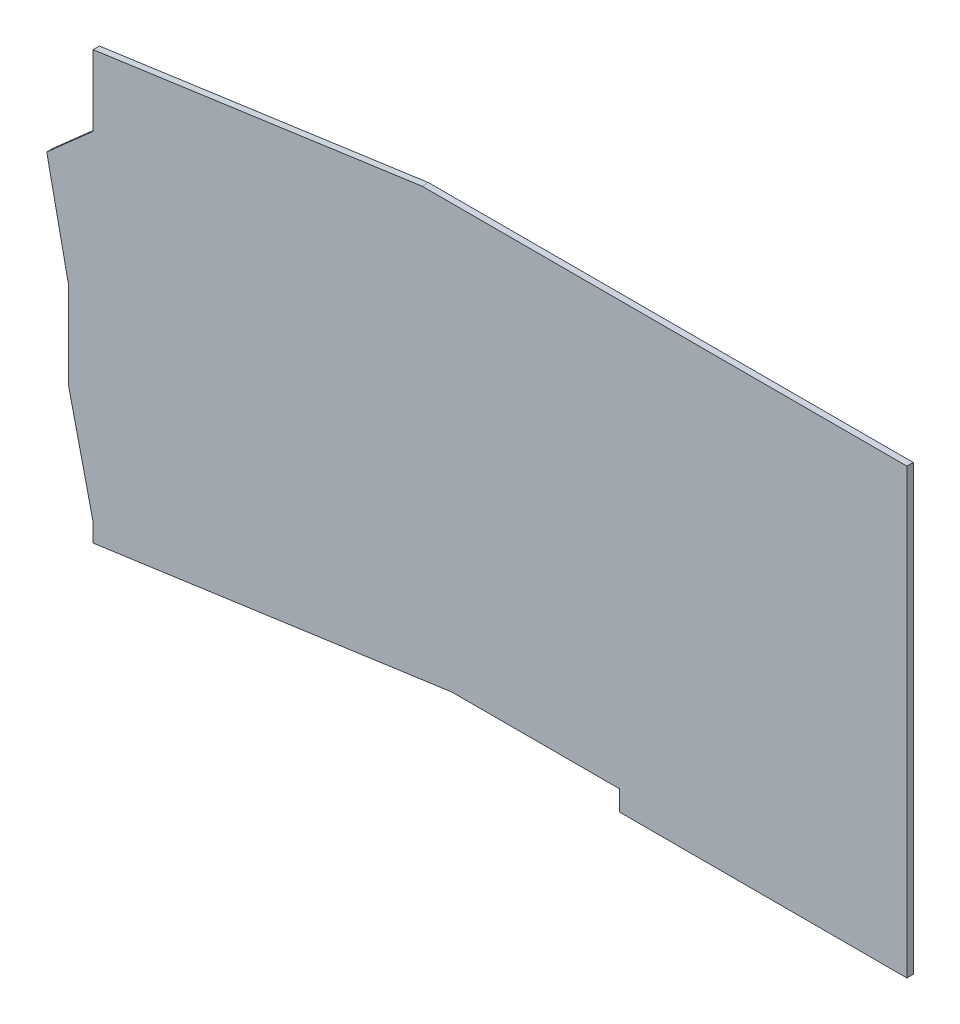
ISO-10303-21;
HEADER;
FILE_DESCRIPTION(('STEP AP214'),'2;1');
FILE_NAME('part.step','',(''),(''),'','','');
FILE_SCHEMA(('AUTOMOTIVE_DESIGN { 1 0 10303 214 1 1 1 1 }'));
ENDSEC;
DATA;
#1=APPLICATION_CONTEXT('core data for automotive mechanical design processes');
#2=APPLICATION_PROTOCOL_DEFINITION('international standard','automotive_design',2000,#1);
#3=PRODUCT_CONTEXT('',#1,'mechanical');
#4=PRODUCT('Part','Part','',(#3));
#5=PRODUCT_RELATED_PRODUCT_CATEGORY('part','',(#4));
#6=PRODUCT_DEFINITION_FORMATION('','',#4);
#7=PRODUCT_DEFINITION_CONTEXT('part definition',#1,'design');
#8=PRODUCT_DEFINITION('design','',#6,#7);
#9=PRODUCT_DEFINITION_SHAPE('','',#8);
#10=(LENGTH_UNIT() NAMED_UNIT(*) SI_UNIT(.MILLI.,.METRE.));
#11=(NAMED_UNIT(*) PLANE_ANGLE_UNIT() SI_UNIT($,.RADIAN.));
#12=(NAMED_UNIT(*) SI_UNIT($,.STERADIAN.) SOLID_ANGLE_UNIT());
#13=UNCERTAINTY_MEASURE_WITH_UNIT(LENGTH_MEASURE(1.E-05),#10,'distance_accuracy_value','');
#14=(GEOMETRIC_REPRESENTATION_CONTEXT(3) GLOBAL_UNCERTAINTY_ASSIGNED_CONTEXT((#13)) GLOBAL_UNIT_ASSIGNED_CONTEXT((#10,
#11,#12)) REPRESENTATION_CONTEXT('',''));
#15=CARTESIAN_POINT('',(0.,0.,0.));
#16=DIRECTION('',(0.,0.,1.));
#17=DIRECTION('',(1.,0.,0.));
#18=AXIS2_PLACEMENT_3D('',#15,#16,#17);
#19=CARTESIAN_POINT('',(128.863446305755,57.7785600457267,1.5));
#20=DIRECTION('',(0.978814898005859,0.204747150021143,0.));
#21=DIRECTION('',(-0.204747150021143,0.978814898005859,0.));
#22=AXIS2_PLACEMENT_3D('',#19,#20,#21);
#23=PLANE('',#22);
#24=DIRECTION('',(0.204747150021143,-0.978814898005859,0.));
#25=VECTOR('',#24,1.);
#26=CARTESIAN_POINT('',(128.863446305755,57.7785600457267,0.));
#27=LINE('',#26,#25);
#28=CARTESIAN_POINT('',(128.863446305755,57.7785600457267,0.));
#29=VERTEX_POINT('',#28);
#30=CARTESIAN_POINT('',(134.062572146089,32.923601973779,0.));
#31=VERTEX_POINT('',#30);
#32=EDGE_CURVE('E159',#29,#31,#27,.T.);
#33=ORIENTED_EDGE('',*,*,#32,.T.);
#34=DIRECTION('',(0.,0.,-1.));
#35=VECTOR('',#34,1.);
#36=CARTESIAN_POINT('',(134.062572146089,32.923601973779,1.5));
#37=LINE('',#36,#35);
#38=CARTESIAN_POINT('',(134.062572146089,32.923601973779,1.5));
#39=VERTEX_POINT('',#38);
#40=EDGE_CURVE('E11',#39,#31,#37,.T.);
#41=ORIENTED_EDGE('',*,*,#40,.F.);
#42=DIRECTION('',(0.204747150021143,-0.978814898005859,0.));
#43=VECTOR('',#42,1.);
#44=CARTESIAN_POINT('',(128.863446305755,57.7785600457267,1.5));
#45=LINE('',#44,#43);
#46=CARTESIAN_POINT('',(128.863446305755,57.7785600457267,1.5));
#47=VERTEX_POINT('',#46);
#48=EDGE_CURVE('E183',#47,#39,#45,.T.);
#49=ORIENTED_EDGE('',*,*,#48,.F.);
#50=DIRECTION('',(0.,0.,-1.));
#51=VECTOR('',#50,1.);
#52=CARTESIAN_POINT('',(128.863446305755,57.7785600457267,1.5));
#53=LINE('',#52,#51);
#54=EDGE_CURVE('E155',#47,#29,#53,.T.);
#55=ORIENTED_EDGE('',*,*,#54,.T.);
#56=EDGE_LOOP('',(#33,#41,#49,#55));
#57=FACE_BOUND('',#56,.T.);
#58=ADVANCED_FACE('F33',(#57),#23,.F.);
#59=CARTESIAN_POINT('',(134.062572146089,32.923601973779,1.5));
#60=DIRECTION('',(1.,0.,0.));
#61=DIRECTION('',(0.,0.,-1.));
#62=AXIS2_PLACEMENT_3D('',#59,#60,#61);
#63=PLANE('',#62);
#64=DIRECTION('',(0.,-1.,0.));
#65=VECTOR('',#64,1.);
#66=CARTESIAN_POINT('',(134.062572146089,32.923601973779,0.));
#67=LINE('',#66,#65);
#68=CARTESIAN_POINT('',(134.062572146089,12.3008028689447,0.));
#69=VERTEX_POINT('',#68);
#70=EDGE_CURVE('E162',#31,#69,#67,.T.);
#71=ORIENTED_EDGE('',*,*,#70,.T.);
#72=DIRECTION('',(0.,0.,-1.));
#73=VECTOR('',#72,1.);
#74=CARTESIAN_POINT('',(134.062572146089,12.3008028689447,1.5));
#75=LINE('',#74,#73);
#76=CARTESIAN_POINT('',(134.062572146089,12.3008028689447,1.5));
#77=VERTEX_POINT('',#76);
#78=EDGE_CURVE('E41',#77,#69,#75,.T.);
#79=ORIENTED_EDGE('',*,*,#78,.F.);
#80=DIRECTION('',(0.,-1.,0.));
#81=VECTOR('',#80,1.);
#82=CARTESIAN_POINT('',(134.062572146089,32.923601973779,1.5));
#83=LINE('',#82,#81);
#84=EDGE_CURVE('E107',#39,#77,#83,.T.);
#85=ORIENTED_EDGE('',*,*,#84,.F.);
#86=ORIENTED_EDGE('',*,*,#40,.T.);
#87=EDGE_LOOP('',(#71,#79,#85,#86));
#88=FACE_BOUND('',#87,.T.);
#89=ADVANCED_FACE('F266',(#88),#63,.F.);
#90=CARTESIAN_POINT('',(134.062572146089,12.3008028689447,1.5));
#91=DIRECTION('',(0.974112033772326,0.2260657994035,0.));
#92=DIRECTION('',(-0.2260657994035,0.974112033772326,0.));
#93=AXIS2_PLACEMENT_3D('',#90,#91,#92);
#94=PLANE('',#93);
#95=DIRECTION('',(0.2260657994035,-0.974112033772326,0.));
#96=VECTOR('',#95,1.);
#97=CARTESIAN_POINT('',(134.062572146089,12.3008028689447,0.));
#98=LINE('',#97,#96);
#99=CARTESIAN_POINT('',(139.839489186045,-12.5917922143182,0.));
#100=VERTEX_POINT('',#99);
#101=EDGE_CURVE('E164',#69,#100,#98,.T.);
#102=ORIENTED_EDGE('',*,*,#101,.T.);
#103=DIRECTION('',(0.,0.,-1.));
#104=VECTOR('',#103,1.);
#105=CARTESIAN_POINT('',(139.839489186045,-12.5917922143182,1.5));
#106=LINE('',#105,#104);
#107=CARTESIAN_POINT('',(139.839489186045,-12.5917922143182,1.5));
#108=VERTEX_POINT('',#107);
#109=EDGE_CURVE('E205',#108,#100,#106,.T.);
#110=ORIENTED_EDGE('',*,*,#109,.F.);
#111=DIRECTION('',(0.2260657994035,-0.974112033772326,0.));
#112=VECTOR('',#111,1.);
#113=CARTESIAN_POINT('',(134.062572146089,12.3008028689447,1.5));
#114=LINE('',#113,#112);
#115=EDGE_CURVE('E213',#77,#108,#114,.T.);
#116=ORIENTED_EDGE('',*,*,#115,.F.);
#117=ORIENTED_EDGE('',*,*,#78,.T.);
#118=EDGE_LOOP('',(#102,#110,#116,#117));
#119=FACE_BOUND('',#118,.T.);
#120=ADVANCED_FACE('F211',(#119),#94,.F.);
#121=CARTESIAN_POINT('',(139.839489186045,-12.5917922143182,1.5));
#122=DIRECTION('',(1.,0.,0.));
#123=DIRECTION('',(0.,0.,-1.));
#124=AXIS2_PLACEMENT_3D('',#121,#122,#123);
#125=PLANE('',#124);
#126=DIRECTION('',(0.,-1.,0.));
#127=VECTOR('',#126,1.);
#128=CARTESIAN_POINT('',(139.839489186045,-12.5917922143182,0.));
#129=LINE('',#128,#127);
#130=CARTESIAN_POINT('',(139.839489186045,-16.928223482479,0.));
#131=VERTEX_POINT('',#130);
#132=EDGE_CURVE('E166',#100,#131,#129,.T.);
#133=ORIENTED_EDGE('',*,*,#132,.T.);
#134=DIRECTION('',(0.,0.,-1.));
#135=VECTOR('',#134,1.);
#136=CARTESIAN_POINT('',(139.839489186045,-16.928223482479,1.5));
#137=LINE('',#136,#135);
#138=CARTESIAN_POINT('',(139.839489186045,-16.928223482479,1.5));
#139=VERTEX_POINT('',#138);
#140=EDGE_CURVE('E202',#139,#131,#137,.T.);
#141=ORIENTED_EDGE('',*,*,#140,.F.);
#142=DIRECTION('',(0.,-1.,0.));
#143=VECTOR('',#142,1.);
#144=CARTESIAN_POINT('',(139.839489186045,-12.5917922143182,1.5));
#145=LINE('',#144,#143);
#146=EDGE_CURVE('E231',#108,#139,#145,.T.);
#147=ORIENTED_EDGE('',*,*,#146,.F.);
#148=ORIENTED_EDGE('',*,*,#109,.T.);
#149=EDGE_LOOP('',(#133,#141,#147,#148));
#150=FACE_BOUND('',#149,.T.);
#151=ADVANCED_FACE('F222',(#150),#125,.F.);
#152=CARTESIAN_POINT('',(139.839489186045,-16.928223482479,1.5));
#153=DIRECTION('',(-0.139075137583757,0.990281831655039,0.));
#154=DIRECTION('',(-0.990281831655039,-0.139075137583757,0.));
#155=AXIS2_PLACEMENT_3D('',#152,#153,#154);
#156=PLANE('',#155);
#157=DIRECTION('',(0.990281831655039,0.139075137583757,0.));
#158=VECTOR('',#157,1.);
#159=CARTESIAN_POINT('',(139.839489186045,-16.928223482479,0.));
#160=LINE('',#159,#158);
#161=CARTESIAN_POINT('',(224.774174161684,-5.,0.));
#162=VERTEX_POINT('',#161);
#163=EDGE_CURVE('E168',#131,#162,#160,.T.);
#164=ORIENTED_EDGE('',*,*,#163,.T.);
#165=DIRECTION('',(0.,0.,-1.));
#166=VECTOR('',#165,1.);
#167=CARTESIAN_POINT('',(224.774174161684,-5.,1.5));
#168=LINE('',#167,#166);
#169=CARTESIAN_POINT('',(224.774174161684,-5.,1.5));
#170=VERTEX_POINT('',#169);
#171=EDGE_CURVE('E199',#170,#162,#168,.T.);
#172=ORIENTED_EDGE('',*,*,#171,.F.);
#173=DIRECTION('',(0.990281831655039,0.139075137583757,0.));
#174=VECTOR('',#173,1.);
#175=CARTESIAN_POINT('',(139.839489186045,-16.928223482479,1.5));
#176=LINE('',#175,#174);
#177=EDGE_CURVE('E228',#139,#170,#176,.T.);
#178=ORIENTED_EDGE('',*,*,#177,.F.);
#179=ORIENTED_EDGE('',*,*,#140,.T.);
#180=EDGE_LOOP('',(#164,#172,#178,#179));
#181=FACE_BOUND('',#180,.T.);
#182=ADVANCED_FACE('F226',(#181),#156,.F.);
#183=CARTESIAN_POINT('',(224.774174161684,-5.,1.5));
#184=DIRECTION('',(0.,1.,0.));
#185=DIRECTION('',(-1.,0.,0.));
#186=AXIS2_PLACEMENT_3D('',#183,#184,#185);
#187=PLANE('',#186);
#188=DIRECTION('',(1.,0.,0.));
#189=VECTOR('',#188,1.);
#190=CARTESIAN_POINT('',(224.774174161684,-5.,0.));
#191=LINE('',#190,#189);
#192=CARTESIAN_POINT('',(264.483473527003,-5.,0.));
#193=VERTEX_POINT('',#192);
#194=EDGE_CURVE('E170',#162,#193,#191,.T.);
#195=ORIENTED_EDGE('',*,*,#194,.T.);
#196=DIRECTION('',(0.,0.,-1.));
#197=VECTOR('',#196,1.);
#198=CARTESIAN_POINT('',(264.483473527003,-5.,1.5));
#199=LINE('',#198,#197);
#200=CARTESIAN_POINT('',(264.483473527003,-5.,1.5));
#201=VERTEX_POINT('',#200);
#202=EDGE_CURVE('E196',#201,#193,#199,.T.);
#203=ORIENTED_EDGE('',*,*,#202,.F.);
#204=DIRECTION('',(1.,0.,0.));
#205=VECTOR('',#204,1.);
#206=CARTESIAN_POINT('',(224.774174161684,-5.,1.5));
#207=LINE('',#206,#205);
#208=EDGE_CURVE('E230',#170,#201,#207,.T.);
#209=ORIENTED_EDGE('',*,*,#208,.F.);
#210=ORIENTED_EDGE('',*,*,#171,.T.);
#211=EDGE_LOOP('',(#195,#203,#209,#210));
#212=FACE_BOUND('',#211,.T.);
#213=ADVANCED_FACE('F279',(#212),#187,.F.);
#214=CARTESIAN_POINT('',(264.483473527003,-5.,1.5));
#215=DIRECTION('',(1.,0.,0.));
#216=DIRECTION('',(0.,0.,-1.));
#217=AXIS2_PLACEMENT_3D('',#214,#215,#216);
#218=PLANE('',#217);
#219=DIRECTION('',(0.,-1.,0.));
#220=VECTOR('',#219,1.);
#221=CARTESIAN_POINT('',(264.483473527003,-5.,0.));
#222=LINE('',#221,#220);
#223=CARTESIAN_POINT('',(264.483473527003,-9.76217406489741,0.));
#224=VERTEX_POINT('',#223);
#225=EDGE_CURVE('E172',#193,#224,#222,.T.);
#226=ORIENTED_EDGE('',*,*,#225,.T.);
#227=DIRECTION('',(0.,0.,-1.));
#228=VECTOR('',#227,1.);
#229=CARTESIAN_POINT('',(264.483473527003,-9.76217406489741,1.5));
#230=LINE('',#229,#228);
#231=CARTESIAN_POINT('',(264.483473527003,-9.76217406489741,1.5));
#232=VERTEX_POINT('',#231);
#233=EDGE_CURVE('E193',#232,#224,#230,.T.);
#234=ORIENTED_EDGE('',*,*,#233,.F.);
#235=DIRECTION('',(0.,-1.,0.));
#236=VECTOR('',#235,1.);
#237=CARTESIAN_POINT('',(264.483473527003,-5.,1.5));
#238=LINE('',#237,#236);
#239=EDGE_CURVE('E233',#201,#232,#238,.T.);
#240=ORIENTED_EDGE('',*,*,#239,.F.);
#241=ORIENTED_EDGE('',*,*,#202,.T.);
#242=EDGE_LOOP('',(#226,#234,#240,#241));
#243=FACE_BOUND('',#242,.T.);
#244=ADVANCED_FACE('F282',(#243),#218,.F.);
#245=CARTESIAN_POINT('',(264.483473527003,-9.76217406489741,1.5));
#246=DIRECTION('',(0.,1.,0.));
#247=DIRECTION('',(-1.,0.,0.));
#248=AXIS2_PLACEMENT_3D('',#245,#246,#247);
#249=PLANE('',#248);
#250=DIRECTION('',(1.,0.,0.));
#251=VECTOR('',#250,1.);
#252=CARTESIAN_POINT('',(264.483473527003,-9.76217406489741,0.));
#253=LINE('',#252,#251);
#254=CARTESIAN_POINT('',(332.522866793278,-9.7621740648974,0.));
#255=VERTEX_POINT('',#254);
#256=EDGE_CURVE('E174',#224,#255,#253,.T.);
#257=ORIENTED_EDGE('',*,*,#256,.T.);
#258=DIRECTION('',(0.,0.,-1.));
#259=VECTOR('',#258,1.);
#260=CARTESIAN_POINT('',(332.522866793278,-9.7621740648974,1.5));
#261=LINE('',#260,#259);
#262=CARTESIAN_POINT('',(332.522866793278,-9.7621740648974,1.5));
#263=VERTEX_POINT('',#262);
#264=EDGE_CURVE('E190',#263,#255,#261,.T.);
#265=ORIENTED_EDGE('',*,*,#264,.F.);
#266=DIRECTION('',(1.,0.,0.));
#267=VECTOR('',#266,1.);
#268=CARTESIAN_POINT('',(264.483473527003,-9.76217406489741,1.5));
#269=LINE('',#268,#267);
#270=EDGE_CURVE('E239',#232,#263,#269,.T.);
#271=ORIENTED_EDGE('',*,*,#270,.F.);
#272=ORIENTED_EDGE('',*,*,#233,.T.);
#273=EDGE_LOOP('',(#257,#265,#271,#272));
#274=FACE_BOUND('',#273,.T.);
#275=ADVANCED_FACE('F286',(#274),#249,.F.);
#276=CARTESIAN_POINT('',(332.522866793278,-9.7621740648974,1.5));
#277=DIRECTION('',(-1.,0.,0.));
#278=DIRECTION('',(0.,0.,1.));
#279=AXIS2_PLACEMENT_3D('',#276,#277,#278);
#280=PLANE('',#279);
#281=DIRECTION('',(0.,1.,0.));
#282=VECTOR('',#281,1.);
#283=CARTESIAN_POINT('',(332.522866793278,-9.7621740648974,0.));
#284=LINE('',#283,#282);
#285=CARTESIAN_POINT('',(332.522866793278,95.1941950750205,0.));
#286=VERTEX_POINT('',#285);
#287=EDGE_CURVE('E176',#255,#286,#284,.T.);
#288=ORIENTED_EDGE('',*,*,#287,.T.);
#289=DIRECTION('',(0.,0.,-1.));
#290=VECTOR('',#289,1.);
#291=CARTESIAN_POINT('',(332.522866793278,95.1941950750205,1.5));
#292=LINE('',#291,#290);
#293=CARTESIAN_POINT('',(332.522866793278,95.1941950750205,1.5));
#294=VERTEX_POINT('',#293);
#295=EDGE_CURVE('E187',#294,#286,#292,.T.);
#296=ORIENTED_EDGE('',*,*,#295,.F.);
#297=DIRECTION('',(0.,1.,0.));
#298=VECTOR('',#297,1.);
#299=CARTESIAN_POINT('',(332.522866793278,-9.7621740648974,1.5));
#300=LINE('',#299,#298);
#301=EDGE_CURVE('E241',#263,#294,#300,.T.);
#302=ORIENTED_EDGE('',*,*,#301,.F.);
#303=ORIENTED_EDGE('',*,*,#264,.T.);
#304=EDGE_LOOP('',(#288,#296,#302,#303));
#305=FACE_BOUND('',#304,.T.);
#306=ADVANCED_FACE('F247',(#305),#280,.F.);
#307=CARTESIAN_POINT('',(332.522866793278,95.1941950750205,1.5));
#308=DIRECTION('',(0.,-1.,0.));
#309=DIRECTION('',(0.,0.,-1.));
#310=AXIS2_PLACEMENT_3D('',#307,#308,#309);
#311=PLANE('',#310);
#312=DIRECTION('',(-1.,0.,0.));
#313=VECTOR('',#312,1.);
#314=CARTESIAN_POINT('',(332.522866793278,95.1941950750205,0.));
#315=LINE('',#314,#313);
#316=CARTESIAN_POINT('',(217.724335712032,95.1941950750205,0.));
#317=VERTEX_POINT('',#316);
#318=EDGE_CURVE('E178',#286,#317,#315,.T.);
#319=ORIENTED_EDGE('',*,*,#318,.T.);
#320=DIRECTION('',(0.,0.,-1.));
#321=VECTOR('',#320,1.);
#322=CARTESIAN_POINT('',(217.724335712032,95.1941950750205,1.5));
#323=LINE('',#322,#321);
#324=CARTESIAN_POINT('',(217.724335712032,95.1941950750205,1.5));
#325=VERTEX_POINT('',#324);
#326=EDGE_CURVE('E150',#325,#317,#323,.T.);
#327=ORIENTED_EDGE('',*,*,#326,.F.);
#328=DIRECTION('',(-1.,0.,0.));
#329=VECTOR('',#328,1.);
#330=CARTESIAN_POINT('',(332.522866793278,95.1941950750205,1.5));
#331=LINE('',#330,#329);
#332=EDGE_CURVE('E141',#294,#325,#331,.T.);
#333=ORIENTED_EDGE('',*,*,#332,.F.);
#334=ORIENTED_EDGE('',*,*,#295,.T.);
#335=EDGE_LOOP('',(#319,#327,#333,#334));
#336=FACE_BOUND('',#335,.T.);
#337=ADVANCED_FACE('F251',(#336),#311,.F.);
#338=CARTESIAN_POINT('',(217.724335712032,95.1941950750205,1.5));
#339=DIRECTION('',(0.139178873576319,-0.990267257436106,0.));
#340=DIRECTION('',(0.990267257436106,0.139178873576319,0.));
#341=AXIS2_PLACEMENT_3D('',#338,#339,#340);
#342=PLANE('',#341);
#343=DIRECTION('',(-0.990267257436106,-0.139178873576319,0.));
#344=VECTOR('',#343,1.);
#345=CARTESIAN_POINT('',(217.724335712032,95.1941950750205,0.));
#346=LINE('',#345,#344);
#347=CARTESIAN_POINT('',(139.839489186045,84.2477307475853,0.));
#348=VERTEX_POINT('',#347);
#349=EDGE_CURVE('E149',#317,#348,#346,.T.);
#350=ORIENTED_EDGE('',*,*,#349,.T.);
#351=DIRECTION('',(0.,0.,-1.));
#352=VECTOR('',#351,1.);
#353=CARTESIAN_POINT('',(139.839489186045,84.2477307475853,1.5));
#354=LINE('',#353,#352);
#355=CARTESIAN_POINT('',(139.839489186045,84.2477307475853,1.5));
#356=VERTEX_POINT('',#355);
#357=EDGE_CURVE('E146',#356,#348,#354,.T.);
#358=ORIENTED_EDGE('',*,*,#357,.F.);
#359=DIRECTION('',(-0.990267257436106,-0.139178873576319,0.));
#360=VECTOR('',#359,1.);
#361=CARTESIAN_POINT('',(217.724335712032,95.1941950750205,1.5));
#362=LINE('',#361,#360);
#363=EDGE_CURVE('E135',#325,#356,#362,.T.);
#364=ORIENTED_EDGE('',*,*,#363,.F.);
#365=ORIENTED_EDGE('',*,*,#326,.T.);
#366=EDGE_LOOP('',(#350,#358,#364,#365));
#367=FACE_BOUND('',#366,.T.);
#368=ADVANCED_FACE('F147',(#367),#342,.F.);
#369=CARTESIAN_POINT('',(139.839489186045,84.2477307475853,1.5));
#370=DIRECTION('',(1.,0.,0.));
#371=DIRECTION('',(0.,1.,0.));
#372=AXIS2_PLACEMENT_3D('',#369,#370,#371);
#373=PLANE('',#372);
#374=DIRECTION('',(0.,-1.,0.));
#375=VECTOR('',#374,1.);
#376=CARTESIAN_POINT('',(139.839489186045,84.2477307475853,0.));
#377=LINE('',#376,#375);
#378=CARTESIAN_POINT('',(139.839489186045,67.5001405750184,0.));
#379=VERTEX_POINT('',#378);
#380=EDGE_CURVE('E93',#348,#379,#377,.T.);
#381=ORIENTED_EDGE('',*,*,#380,.T.);
#382=DIRECTION('',(0.,0.,-1.));
#383=VECTOR('',#382,1.);
#384=CARTESIAN_POINT('',(139.839489186045,67.5001405750184,1.5));
#385=LINE('',#384,#383);
#386=CARTESIAN_POINT('',(139.839489186045,67.5001405750184,1.5));
#387=VERTEX_POINT('',#386);
#388=EDGE_CURVE('E151',#387,#379,#385,.T.);
#389=ORIENTED_EDGE('',*,*,#388,.F.);
#390=DIRECTION('',(0.,-1.,0.));
#391=VECTOR('',#390,1.);
#392=CARTESIAN_POINT('',(139.839489186045,84.2477307475853,1.5));
#393=LINE('',#392,#391);
#394=EDGE_CURVE('E139',#356,#387,#393,.T.);
#395=ORIENTED_EDGE('',*,*,#394,.F.);
#396=ORIENTED_EDGE('',*,*,#357,.T.);
#397=EDGE_LOOP('',(#381,#389,#395,#396));
#398=FACE_BOUND('',#397,.T.);
#399=ADVANCED_FACE('F153',(#398),#373,.F.);
#400=CARTESIAN_POINT('',(139.839489186045,67.5001405750184,1.5));
#401=DIRECTION('',(0.66303304957195,-0.748590124951779,0.));
#402=DIRECTION('',(0.748590124951779,0.66303304957195,0.));
#403=AXIS2_PLACEMENT_3D('',#400,#401,#402);
#404=PLANE('',#403);
#405=DIRECTION('',(-0.748590124951779,-0.66303304957195,0.));
#406=VECTOR('',#405,1.);
#407=CARTESIAN_POINT('',(139.839489186045,67.5001405750184,0.));
#408=LINE('',#407,#406);
#409=EDGE_CURVE('E99',#379,#29,#408,.T.);
#410=ORIENTED_EDGE('',*,*,#409,.T.);
#411=ORIENTED_EDGE('',*,*,#54,.F.);
#412=DIRECTION('',(-0.748590124951779,-0.66303304957195,0.));
#413=VECTOR('',#412,1.);
#414=CARTESIAN_POINT('',(139.839489186045,67.5001405750184,1.5));
#415=LINE('',#414,#413);
#416=EDGE_CURVE('E49',#387,#47,#415,.T.);
#417=ORIENTED_EDGE('',*,*,#416,.F.);
#418=ORIENTED_EDGE('',*,*,#388,.T.);
#419=EDGE_LOOP('',(#410,#411,#417,#418));
#420=FACE_BOUND('',#419,.T.);
#421=ADVANCED_FACE('F255',(#420),#404,.F.);
#422=CARTESIAN_POINT('',(0.,0.,1.5));
#423=DIRECTION('',(0.,0.,-1.));
#424=DIRECTION('',(-1.,0.,0.));
#425=AXIS2_PLACEMENT_3D('',#422,#423,#424);
#426=PLANE('',#425);
#427=ORIENTED_EDGE('',*,*,#48,.T.);
#428=ORIENTED_EDGE('',*,*,#84,.T.);
#429=ORIENTED_EDGE('',*,*,#115,.T.);
#430=ORIENTED_EDGE('',*,*,#146,.T.);
#431=ORIENTED_EDGE('',*,*,#177,.T.);
#432=ORIENTED_EDGE('',*,*,#208,.T.);
#433=ORIENTED_EDGE('',*,*,#239,.T.);
#434=ORIENTED_EDGE('',*,*,#270,.T.);
#435=ORIENTED_EDGE('',*,*,#301,.T.);
#436=ORIENTED_EDGE('',*,*,#332,.T.);
#437=ORIENTED_EDGE('',*,*,#363,.T.);
#438=ORIENTED_EDGE('',*,*,#394,.T.);
#439=ORIENTED_EDGE('',*,*,#416,.T.);
#440=EDGE_LOOP('',(#427,#428,#429,#430,#431,#432,#433,#434,#435,#436,#437,#438,#439));
#441=FACE_BOUND('',#440,.T.);
#442=ADVANCED_FACE('F137',(#441),#426,.F.);
#443=CARTESIAN_POINT('',(0.,0.,0.));
#444=DIRECTION('',(0.,0.,-1.));
#445=DIRECTION('',(-1.,0.,0.));
#446=AXIS2_PLACEMENT_3D('',#443,#444,#445);
#447=PLANE('',#446);
#448=ORIENTED_EDGE('',*,*,#32,.F.);
#449=ORIENTED_EDGE('',*,*,#409,.F.);
#450=ORIENTED_EDGE('',*,*,#380,.F.);
#451=ORIENTED_EDGE('',*,*,#349,.F.);
#452=ORIENTED_EDGE('',*,*,#318,.F.);
#453=ORIENTED_EDGE('',*,*,#287,.F.);
#454=ORIENTED_EDGE('',*,*,#256,.F.);
#455=ORIENTED_EDGE('',*,*,#225,.F.);
#456=ORIENTED_EDGE('',*,*,#194,.F.);
#457=ORIENTED_EDGE('',*,*,#163,.F.);
#458=ORIENTED_EDGE('',*,*,#132,.F.);
#459=ORIENTED_EDGE('',*,*,#101,.F.);
#460=ORIENTED_EDGE('',*,*,#70,.F.);
#461=EDGE_LOOP('',(#448,#449,#450,#451,#452,#453,#454,#455,#456,#457,#458,#459,#460));
#462=FACE_BOUND('',#461,.T.);
#463=ADVANCED_FACE('F217',(#462),#447,.T.);
#464=CLOSED_SHELL('',(#58,#89,#120,#151,#182,#213,#244,#275,#306,#337,#368,#399,#421,#442,#463));
#465=MANIFOLD_SOLID_BREP('B2',#464);
#466=ADVANCED_BREP_SHAPE_REPRESENTATION('',(#18,#465),#14);
#467=SHAPE_DEFINITION_REPRESENTATION(#9,#466);
ENDSEC;
END-ISO-10303-21;
